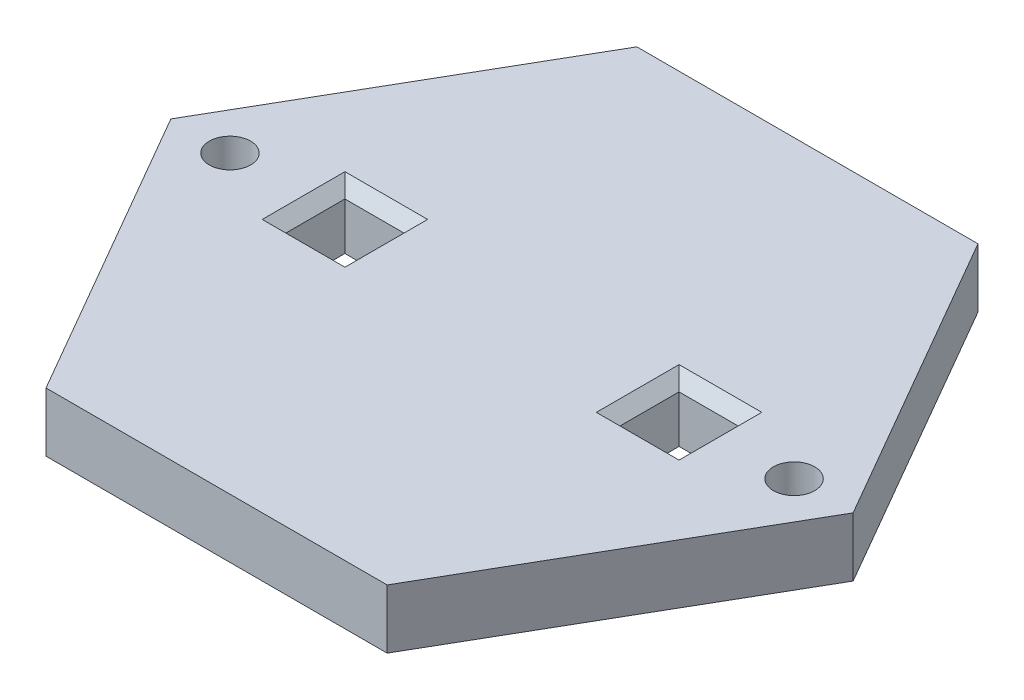
ISO-10303-21;
HEADER;
FILE_DESCRIPTION(('STEP AP214'),'2;1');
FILE_NAME('part.step','',(''),(''),'','','');
FILE_SCHEMA(('AUTOMOTIVE_DESIGN { 1 0 10303 214 1 1 1 1 }'));
ENDSEC;
DATA;
#1=APPLICATION_CONTEXT('core data for automotive mechanical design processes');
#2=APPLICATION_PROTOCOL_DEFINITION('international standard','automotive_design',2000,#1);
#3=PRODUCT_CONTEXT('',#1,'mechanical');
#4=PRODUCT('Part','Part','',(#3));
#5=PRODUCT_RELATED_PRODUCT_CATEGORY('part','',(#4));
#6=PRODUCT_DEFINITION_FORMATION('','',#4);
#7=PRODUCT_DEFINITION_CONTEXT('part definition',#1,'design');
#8=PRODUCT_DEFINITION('design','',#6,#7);
#9=PRODUCT_DEFINITION_SHAPE('','',#8);
#10=(LENGTH_UNIT() NAMED_UNIT(*) SI_UNIT(.MILLI.,.METRE.));
#11=(NAMED_UNIT(*) PLANE_ANGLE_UNIT() SI_UNIT($,.RADIAN.));
#12=(NAMED_UNIT(*) SI_UNIT($,.STERADIAN.) SOLID_ANGLE_UNIT());
#13=UNCERTAINTY_MEASURE_WITH_UNIT(LENGTH_MEASURE(1.E-05),#10,'distance_accuracy_value','');
#14=(GEOMETRIC_REPRESENTATION_CONTEXT(3) GLOBAL_UNCERTAINTY_ASSIGNED_CONTEXT((#13)) GLOBAL_UNIT_ASSIGNED_CONTEXT((#10,
#11,#12)) REPRESENTATION_CONTEXT('',''));
#15=CARTESIAN_POINT('',(0.,0.,0.));
#16=DIRECTION('',(0.,0.,1.));
#17=DIRECTION('',(1.,0.,0.));
#18=AXIS2_PLACEMENT_3D('',#15,#16,#17);
#19=CARTESIAN_POINT('',(-14.4337567297409,5.,-24.9999999999998));
#20=DIRECTION('',(0.866025403784442,0.,0.499999999999995));
#21=DIRECTION('',(0.499999999999995,0.,-0.866025403784442));
#22=AXIS2_PLACEMENT_3D('',#19,#20,#21);
#23=PLANE('',#22);
#24=DIRECTION('',(-0.499999999999995,0.,0.866025403784441));
#25=VECTOR('',#24,1.);
#26=CARTESIAN_POINT('',(-14.4337567297409,0.,-24.9999999999998));
#27=LINE('',#26,#25);
#28=CARTESIAN_POINT('',(-14.4337567297409,0.,-24.9999999999998));
#29=VERTEX_POINT('',#28);
#30=CARTESIAN_POINT('',(-28.8675134594813,0.,0.));
#31=VERTEX_POINT('',#30);
#32=EDGE_CURVE('E231',#29,#31,#27,.T.);
#33=ORIENTED_EDGE('',*,*,#32,.T.);
#34=DIRECTION('',(0.,-1.,0.));
#35=VECTOR('',#34,1.);
#36=CARTESIAN_POINT('',(-28.8675134594813,5.,0.));
#37=LINE('',#36,#35);
#38=CARTESIAN_POINT('',(-28.8675134594813,5.,0.));
#39=VERTEX_POINT('',#38);
#40=EDGE_CURVE('E274',#39,#31,#37,.T.);
#41=ORIENTED_EDGE('',*,*,#40,.F.);
#42=DIRECTION('',(-0.499999999999995,0.,0.866025403784441));
#43=VECTOR('',#42,1.);
#44=CARTESIAN_POINT('',(-14.4337567297409,5.,-24.9999999999998));
#45=LINE('',#44,#43);
#46=CARTESIAN_POINT('',(-14.4337567297409,5.,-24.9999999999998));
#47=VERTEX_POINT('',#46);
#48=EDGE_CURVE('E234',#47,#39,#45,.T.);
#49=ORIENTED_EDGE('',*,*,#48,.F.);
#50=DIRECTION('',(0.,-1.,0.));
#51=VECTOR('',#50,1.);
#52=CARTESIAN_POINT('',(-14.4337567297409,5.,-24.9999999999998));
#53=LINE('',#52,#51);
#54=EDGE_CURVE('E248',#47,#29,#53,.T.);
#55=ORIENTED_EDGE('',*,*,#54,.T.);
#56=EDGE_LOOP('',(#33,#41,#49,#55));
#57=FACE_BOUND('',#56,.T.);
#58=ADVANCED_FACE('F33',(#57),#23,.F.);
#59=CARTESIAN_POINT('',(-28.8675134594813,5.,0.));
#60=DIRECTION('',(0.866025403784438,0.,-0.500000000000001));
#61=DIRECTION('',(-0.500000000000001,0.,-0.866025403784438));
#62=AXIS2_PLACEMENT_3D('',#59,#60,#61);
#63=PLANE('',#62);
#64=DIRECTION('',(0.500000000000001,0.,0.866025403784438));
#65=VECTOR('',#64,1.);
#66=CARTESIAN_POINT('',(-28.8675134594813,0.,0.));
#67=LINE('',#66,#65);
#68=CARTESIAN_POINT('',(-14.4337567297406,0.,25.));
#69=VERTEX_POINT('',#68);
#70=EDGE_CURVE('E251',#31,#69,#67,.T.);
#71=ORIENTED_EDGE('',*,*,#70,.T.);
#72=DIRECTION('',(0.,-1.,0.));
#73=VECTOR('',#72,1.);
#74=CARTESIAN_POINT('',(-14.4337567297406,5.,25.));
#75=LINE('',#74,#73);
#76=CARTESIAN_POINT('',(-14.4337567297406,5.,25.));
#77=VERTEX_POINT('',#76);
#78=EDGE_CURVE('E271',#77,#69,#75,.T.);
#79=ORIENTED_EDGE('',*,*,#78,.F.);
#80=DIRECTION('',(0.500000000000001,0.,0.866025403784438));
#81=VECTOR('',#80,1.);
#82=CARTESIAN_POINT('',(-28.8675134594813,5.,0.));
#83=LINE('',#82,#81);
#84=EDGE_CURVE('E237',#39,#77,#83,.T.);
#85=ORIENTED_EDGE('',*,*,#84,.F.);
#86=ORIENTED_EDGE('',*,*,#40,.T.);
#87=EDGE_LOOP('',(#71,#79,#85,#86));
#88=FACE_BOUND('',#87,.T.);
#89=ADVANCED_FACE('F361',(#88),#63,.F.);
#90=CARTESIAN_POINT('',(-14.4337567297406,5.,25.));
#91=DIRECTION('',(0.,0.,-1.));
#92=DIRECTION('',(-1.,0.,0.));
#93=AXIS2_PLACEMENT_3D('',#90,#91,#92);
#94=PLANE('',#93);
#95=DIRECTION('',(1.,0.,0.));
#96=VECTOR('',#95,1.);
#97=CARTESIAN_POINT('',(-14.4337567297406,0.,25.));
#98=LINE('',#97,#96);
#99=CARTESIAN_POINT('',(14.4337567297408,0.,24.9999999999999));
#100=VERTEX_POINT('',#99);
#101=EDGE_CURVE('E253',#69,#100,#98,.T.);
#102=ORIENTED_EDGE('',*,*,#101,.T.);
#103=DIRECTION('',(0.,-1.,0.));
#104=VECTOR('',#103,1.);
#105=CARTESIAN_POINT('',(14.4337567297408,5.,24.9999999999999));
#106=LINE('',#105,#104);
#107=CARTESIAN_POINT('',(14.4337567297408,5.,24.9999999999999));
#108=VERTEX_POINT('',#107);
#109=EDGE_CURVE('E268',#108,#100,#106,.T.);
#110=ORIENTED_EDGE('',*,*,#109,.F.);
#111=DIRECTION('',(1.,0.,0.));
#112=VECTOR('',#111,1.);
#113=CARTESIAN_POINT('',(-14.4337567297406,5.,25.));
#114=LINE('',#113,#112);
#115=EDGE_CURVE('E240',#77,#108,#114,.T.);
#116=ORIENTED_EDGE('',*,*,#115,.F.);
#117=ORIENTED_EDGE('',*,*,#78,.T.);
#118=EDGE_LOOP('',(#102,#110,#116,#117));
#119=FACE_BOUND('',#118,.T.);
#120=ADVANCED_FACE('F367',(#119),#94,.F.);
#121=CARTESIAN_POINT('',(14.4337567297408,5.,24.9999999999999));
#122=DIRECTION('',(-0.866025403784442,0.,-0.499999999999995));
#123=DIRECTION('',(-0.499999999999995,0.,0.866025403784442));
#124=AXIS2_PLACEMENT_3D('',#121,#122,#123);
#125=PLANE('',#124);
#126=DIRECTION('',(0.499999999999995,0.,-0.866025403784441));
#127=VECTOR('',#126,1.);
#128=CARTESIAN_POINT('',(14.4337567297408,0.,24.9999999999999));
#129=LINE('',#128,#127);
#130=CARTESIAN_POINT('',(28.8675134594813,0.,-2.01580769085164E-13));
#131=VERTEX_POINT('',#130);
#132=EDGE_CURVE('E255',#100,#131,#129,.T.);
#133=ORIENTED_EDGE('',*,*,#132,.T.);
#134=DIRECTION('',(0.,-1.,0.));
#135=VECTOR('',#134,1.);
#136=CARTESIAN_POINT('',(28.8675134594813,5.,-2.01580769085164E-13));
#137=LINE('',#136,#135);
#138=CARTESIAN_POINT('',(28.8675134594813,5.,-2.01580769085164E-13));
#139=VERTEX_POINT('',#138);
#140=EDGE_CURVE('E265',#139,#131,#137,.T.);
#141=ORIENTED_EDGE('',*,*,#140,.F.);
#142=DIRECTION('',(0.499999999999995,0.,-0.866025403784441));
#143=VECTOR('',#142,1.);
#144=CARTESIAN_POINT('',(14.4337567297408,5.,24.9999999999999));
#145=LINE('',#144,#143);
#146=EDGE_CURVE('E242',#108,#139,#145,.T.);
#147=ORIENTED_EDGE('',*,*,#146,.F.);
#148=ORIENTED_EDGE('',*,*,#109,.T.);
#149=EDGE_LOOP('',(#133,#141,#147,#148));
#150=FACE_BOUND('',#149,.T.);
#151=ADVANCED_FACE('F520',(#150),#125,.F.);
#152=CARTESIAN_POINT('',(28.8675134594813,5.,-2.01580769085164E-13));
#153=DIRECTION('',(-0.866025403784434,0.,0.500000000000007));
#154=DIRECTION('',(0.500000000000007,0.,0.866025403784435));
#155=AXIS2_PLACEMENT_3D('',#152,#153,#154);
#156=PLANE('',#155);
#157=DIRECTION('',(-0.500000000000007,0.,-0.866025403784434));
#158=VECTOR('',#157,1.);
#159=CARTESIAN_POINT('',(28.8675134594813,0.,-2.01580769085164E-13));
#160=LINE('',#159,#158);
#161=CARTESIAN_POINT('',(14.4337567297404,0.,-25.0000000000001));
#162=VERTEX_POINT('',#161);
#163=EDGE_CURVE('E257',#131,#162,#160,.T.);
#164=ORIENTED_EDGE('',*,*,#163,.T.);
#165=DIRECTION('',(0.,-1.,0.));
#166=VECTOR('',#165,1.);
#167=CARTESIAN_POINT('',(14.4337567297404,5.,-25.0000000000001));
#168=LINE('',#167,#166);
#169=CARTESIAN_POINT('',(14.4337567297404,5.,-25.0000000000001));
#170=VERTEX_POINT('',#169);
#171=EDGE_CURVE('E262',#170,#162,#168,.T.);
#172=ORIENTED_EDGE('',*,*,#171,.F.);
#173=DIRECTION('',(-0.500000000000007,0.,-0.866025403784434));
#174=VECTOR('',#173,1.);
#175=CARTESIAN_POINT('',(28.8675134594813,5.,-2.01580769085164E-13));
#176=LINE('',#175,#174);
#177=EDGE_CURVE('E244',#139,#170,#176,.T.);
#178=ORIENTED_EDGE('',*,*,#177,.F.);
#179=ORIENTED_EDGE('',*,*,#140,.T.);
#180=EDGE_LOOP('',(#164,#172,#178,#179));
#181=FACE_BOUND('',#180,.T.);
#182=ADVANCED_FACE('F510',(#181),#156,.F.);
#183=CARTESIAN_POINT('',(14.4337567297404,5.,-25.0000000000001));
#184=DIRECTION('',(0.,0.,1.));
#185=DIRECTION('',(1.,0.,0.));
#186=AXIS2_PLACEMENT_3D('',#183,#184,#185);
#187=PLANE('',#186);
#188=DIRECTION('',(-1.,0.,0.));
#189=VECTOR('',#188,1.);
#190=CARTESIAN_POINT('',(14.4337567297404,0.,-25.0000000000001));
#191=LINE('',#190,#189);
#192=EDGE_CURVE('E238',#162,#29,#191,.T.);
#193=ORIENTED_EDGE('',*,*,#192,.T.);
#194=ORIENTED_EDGE('',*,*,#54,.F.);
#195=DIRECTION('',(-1.,0.,0.));
#196=VECTOR('',#195,1.);
#197=CARTESIAN_POINT('',(14.4337567297404,5.,-25.0000000000001));
#198=LINE('',#197,#196);
#199=EDGE_CURVE('E246',#170,#47,#198,.T.);
#200=ORIENTED_EDGE('',*,*,#199,.F.);
#201=ORIENTED_EDGE('',*,*,#171,.T.);
#202=EDGE_LOOP('',(#193,#194,#200,#201));
#203=FACE_BOUND('',#202,.T.);
#204=ADVANCED_FACE('F475',(#203),#187,.F.);
#205=CARTESIAN_POINT('',(0.,5.,0.));
#206=DIRECTION('',(0.,1.,0.));
#207=DIRECTION('',(0.,0.,1.));
#208=AXIS2_PLACEMENT_3D('',#205,#206,#207);
#209=PLANE('',#208);
#210=DIRECTION('',(0.,0.,1.));
#211=VECTOR('',#210,1.);
#212=CARTESIAN_POINT('',(17.6375134594813,5.,2.5));
#213=LINE('',#212,#211);
#214=CARTESIAN_POINT('',(17.6375134594813,5.,-3.50000000000001));
#215=VERTEX_POINT('',#214);
#216=CARTESIAN_POINT('',(17.6375134594813,5.,3.50000000000001));
#217=VERTEX_POINT('',#216);
#218=EDGE_CURVE('E293',#215,#217,#213,.T.);
#219=ORIENTED_EDGE('',*,*,#218,.T.);
#220=DIRECTION('',(-1.,0.,0.));
#221=VECTOR('',#220,1.);
#222=CARTESIAN_POINT('',(11.6375134594813,5.,3.50000000000001));
#223=LINE('',#222,#221);
#224=CARTESIAN_POINT('',(10.6375134594813,5.,3.50000000000001));
#225=VERTEX_POINT('',#224);
#226=EDGE_CURVE('E295',#217,#225,#223,.T.);
#227=ORIENTED_EDGE('',*,*,#226,.T.);
#228=DIRECTION('',(0.,0.,-1.));
#229=VECTOR('',#228,1.);
#230=CARTESIAN_POINT('',(10.6375134594813,5.,-2.5));
#231=LINE('',#230,#229);
#232=CARTESIAN_POINT('',(10.6375134594813,5.,-3.50000000000001));
#233=VERTEX_POINT('',#232);
#234=EDGE_CURVE('E291',#225,#233,#231,.T.);
#235=ORIENTED_EDGE('',*,*,#234,.T.);
#236=DIRECTION('',(1.,0.,0.));
#237=VECTOR('',#236,1.);
#238=CARTESIAN_POINT('',(16.6375134594813,5.,-3.50000000000001));
#239=LINE('',#238,#237);
#240=EDGE_CURVE('E289',#233,#215,#239,.T.);
#241=ORIENTED_EDGE('',*,*,#240,.T.);
#242=EDGE_LOOP('',(#219,#227,#235,#241));
#243=FACE_BOUND('',#242,.T.);
#244=DIRECTION('',(0.,0.,1.));
#245=VECTOR('',#244,1.);
#246=CARTESIAN_POINT('',(-10.6375134594813,5.,2.5));
#247=LINE('',#246,#245);
#248=CARTESIAN_POINT('',(-10.6375134594813,5.,-3.50000000000001));
#249=VERTEX_POINT('',#248);
#250=CARTESIAN_POINT('',(-10.6375134594813,5.,3.50000000000001));
#251=VERTEX_POINT('',#250);
#252=EDGE_CURVE('E284',#249,#251,#247,.T.);
#253=ORIENTED_EDGE('',*,*,#252,.T.);
#254=DIRECTION('',(-1.,0.,0.));
#255=VECTOR('',#254,1.);
#256=CARTESIAN_POINT('',(-16.6375134594813,5.,3.50000000000001));
#257=LINE('',#256,#255);
#258=CARTESIAN_POINT('',(-17.6375134594813,5.,3.50000000000001));
#259=VERTEX_POINT('',#258);
#260=EDGE_CURVE('E286',#251,#259,#257,.T.);
#261=ORIENTED_EDGE('',*,*,#260,.T.);
#262=DIRECTION('',(0.,0.,-1.));
#263=VECTOR('',#262,1.);
#264=CARTESIAN_POINT('',(-17.6375134594813,5.,-2.5));
#265=LINE('',#264,#263);
#266=CARTESIAN_POINT('',(-17.6375134594813,5.,-3.50000000000001));
#267=VERTEX_POINT('',#266);
#268=EDGE_CURVE('E282',#259,#267,#265,.T.);
#269=ORIENTED_EDGE('',*,*,#268,.T.);
#270=DIRECTION('',(1.,0.,0.));
#271=VECTOR('',#270,1.);
#272=CARTESIAN_POINT('',(-11.6375134594813,5.,-3.50000000000001));
#273=LINE('',#272,#271);
#274=EDGE_CURVE('E280',#267,#249,#273,.T.);
#275=ORIENTED_EDGE('',*,*,#274,.T.);
#276=EDGE_LOOP('',(#253,#261,#269,#275));
#277=FACE_BOUND('',#276,.T.);
#278=CARTESIAN_POINT('',(23.8675134594813,5.,-1.02094204959178E-13));
#279=DIRECTION('',(0.,1.,0.));
#280=DIRECTION('',(0.,0.,1.));
#281=AXIS2_PLACEMENT_3D('',#278,#279,#280);
#282=CIRCLE('',#281,1.75);
#283=CARTESIAN_POINT('',(23.8675134594813,5.,1.7499999999999));
#284=VERTEX_POINT('',#283);
#285=EDGE_CURVE('E215',#284,#284,#282,.T.);
#286=ORIENTED_EDGE('',*,*,#285,.F.);
#287=EDGE_LOOP('',(#286));
#288=FACE_BOUND('',#287,.T.);
#289=CARTESIAN_POINT('',(-23.8675134594813,5.,0.));
#290=DIRECTION('',(0.,1.,0.));
#291=DIRECTION('',(0.,0.,1.));
#292=AXIS2_PLACEMENT_3D('',#289,#290,#291);
#293=CIRCLE('',#292,1.75);
#294=CARTESIAN_POINT('',(-23.8675134594813,5.,1.75));
#295=VERTEX_POINT('',#294);
#296=EDGE_CURVE('E225',#295,#295,#293,.T.);
#297=ORIENTED_EDGE('',*,*,#296,.F.);
#298=EDGE_LOOP('',(#297));
#299=FACE_BOUND('',#298,.T.);
#300=ORIENTED_EDGE('',*,*,#48,.T.);
#301=ORIENTED_EDGE('',*,*,#84,.T.);
#302=ORIENTED_EDGE('',*,*,#115,.T.);
#303=ORIENTED_EDGE('',*,*,#146,.T.);
#304=ORIENTED_EDGE('',*,*,#177,.T.);
#305=ORIENTED_EDGE('',*,*,#199,.T.);
#306=EDGE_LOOP('',(#300,#301,#302,#303,#304,#305));
#307=FACE_BOUND('',#306,.T.);
#308=ADVANCED_FACE('F332',(#243,#277,#288,#299,#307),#209,.T.);
#309=CARTESIAN_POINT('',(0.,0.,0.));
#310=DIRECTION('',(0.,1.,0.));
#311=DIRECTION('',(0.,0.,1.));
#312=AXIS2_PLACEMENT_3D('',#309,#310,#311);
#313=PLANE('',#312);
#314=DIRECTION('',(1.,0.,0.));
#315=VECTOR('',#314,1.);
#316=CARTESIAN_POINT('',(11.6375134594813,0.,2.5));
#317=LINE('',#316,#315);
#318=CARTESIAN_POINT('',(11.6375134594813,0.,2.5));
#319=VERTEX_POINT('',#318);
#320=CARTESIAN_POINT('',(16.6375134594813,0.,2.5));
#321=VERTEX_POINT('',#320);
#322=EDGE_CURVE('E172',#319,#321,#317,.T.);
#323=ORIENTED_EDGE('',*,*,#322,.T.);
#324=DIRECTION('',(0.,0.,-1.));
#325=VECTOR('',#324,1.);
#326=CARTESIAN_POINT('',(16.6375134594813,0.,-2.5));
#327=LINE('',#326,#325);
#328=CARTESIAN_POINT('',(16.6375134594813,0.,-2.5));
#329=VERTEX_POINT('',#328);
#330=EDGE_CURVE('E165',#321,#329,#327,.T.);
#331=ORIENTED_EDGE('',*,*,#330,.T.);
#332=DIRECTION('',(-1.,0.,0.));
#333=VECTOR('',#332,1.);
#334=CARTESIAN_POINT('',(11.6375134594813,0.,-2.5));
#335=LINE('',#334,#333);
#336=CARTESIAN_POINT('',(11.6375134594813,0.,-2.5));
#337=VERTEX_POINT('',#336);
#338=EDGE_CURVE('E176',#329,#337,#335,.T.);
#339=ORIENTED_EDGE('',*,*,#338,.T.);
#340=DIRECTION('',(0.,0.,1.));
#341=VECTOR('',#340,1.);
#342=CARTESIAN_POINT('',(11.6375134594813,0.,-2.5));
#343=LINE('',#342,#341);
#344=EDGE_CURVE('E181',#337,#319,#343,.T.);
#345=ORIENTED_EDGE('',*,*,#344,.T.);
#346=EDGE_LOOP('',(#323,#331,#339,#345));
#347=FACE_BOUND('',#346,.T.);
#348=DIRECTION('',(1.,0.,0.));
#349=VECTOR('',#348,1.);
#350=CARTESIAN_POINT('',(-16.6375134594813,0.,2.5));
#351=LINE('',#350,#349);
#352=CARTESIAN_POINT('',(-16.6375134594813,0.,2.5));
#353=VERTEX_POINT('',#352);
#354=CARTESIAN_POINT('',(-11.6375134594813,0.,2.5));
#355=VERTEX_POINT('',#354);
#356=EDGE_CURVE('E209',#353,#355,#351,.T.);
#357=ORIENTED_EDGE('',*,*,#356,.T.);
#358=DIRECTION('',(0.,0.,-1.));
#359=VECTOR('',#358,1.);
#360=CARTESIAN_POINT('',(-11.6375134594813,0.,-2.5));
#361=LINE('',#360,#359);
#362=CARTESIAN_POINT('',(-11.6375134594813,0.,-2.5));
#363=VERTEX_POINT('',#362);
#364=EDGE_CURVE('E196',#355,#363,#361,.T.);
#365=ORIENTED_EDGE('',*,*,#364,.T.);
#366=DIRECTION('',(-1.,0.,0.));
#367=VECTOR('',#366,1.);
#368=CARTESIAN_POINT('',(-16.6375134594813,0.,-2.5));
#369=LINE('',#368,#367);
#370=CARTESIAN_POINT('',(-16.6375134594813,0.,-2.5));
#371=VERTEX_POINT('',#370);
#372=EDGE_CURVE('E203',#363,#371,#369,.T.);
#373=ORIENTED_EDGE('',*,*,#372,.T.);
#374=DIRECTION('',(0.,0.,1.));
#375=VECTOR('',#374,1.);
#376=CARTESIAN_POINT('',(-16.6375134594813,0.,-2.5));
#377=LINE('',#376,#375);
#378=EDGE_CURVE('E206',#371,#353,#377,.T.);
#379=ORIENTED_EDGE('',*,*,#378,.T.);
#380=EDGE_LOOP('',(#357,#365,#373,#379));
#381=FACE_BOUND('',#380,.T.);
#382=CARTESIAN_POINT('',(23.8675134594813,0.,-1.02094204959178E-13));
#383=DIRECTION('',(0.,1.,0.));
#384=DIRECTION('',(0.,0.,1.));
#385=AXIS2_PLACEMENT_3D('',#382,#383,#384);
#386=CIRCLE('',#385,1.75);
#387=CARTESIAN_POINT('',(23.8675134594813,0.,1.7499999999999));
#388=VERTEX_POINT('',#387);
#389=EDGE_CURVE('E222',#388,#388,#386,.T.);
#390=ORIENTED_EDGE('',*,*,#389,.T.);
#391=EDGE_LOOP('',(#390));
#392=FACE_BOUND('',#391,.T.);
#393=CARTESIAN_POINT('',(-23.8675134594813,0.,0.));
#394=DIRECTION('',(0.,1.,0.));
#395=DIRECTION('',(0.,0.,1.));
#396=AXIS2_PLACEMENT_3D('',#393,#394,#395);
#397=CIRCLE('',#396,1.75);
#398=CARTESIAN_POINT('',(-23.8675134594813,0.,1.75));
#399=VERTEX_POINT('',#398);
#400=EDGE_CURVE('E228',#399,#399,#397,.T.);
#401=ORIENTED_EDGE('',*,*,#400,.T.);
#402=EDGE_LOOP('',(#401));
#403=FACE_BOUND('',#402,.T.);
#404=ORIENTED_EDGE('',*,*,#32,.F.);
#405=ORIENTED_EDGE('',*,*,#192,.F.);
#406=ORIENTED_EDGE('',*,*,#163,.F.);
#407=ORIENTED_EDGE('',*,*,#132,.F.);
#408=ORIENTED_EDGE('',*,*,#101,.F.);
#409=ORIENTED_EDGE('',*,*,#70,.F.);
#410=EDGE_LOOP('',(#404,#405,#406,#407,#408,#409));
#411=FACE_BOUND('',#410,.T.);
#412=ADVANCED_FACE('F183',(#347,#381,#392,#403,#411),#313,.F.);
#413=CARTESIAN_POINT('',(-23.8675134594813,0.,0.));
#414=DIRECTION('',(0.,1.,0.));
#415=DIRECTION('',(0.,0.,1.));
#416=AXIS2_PLACEMENT_3D('',#413,#414,#415);
#417=CYLINDRICAL_SURFACE('',#416,1.75);
#418=ORIENTED_EDGE('',*,*,#400,.F.);
#419=EDGE_LOOP('',(#418));
#420=FACE_BOUND('',#419,.T.);
#421=ORIENTED_EDGE('',*,*,#296,.T.);
#422=EDGE_LOOP('',(#421));
#423=FACE_BOUND('',#422,.T.);
#424=ADVANCED_FACE('F487',(#420,#423),#417,.F.);
#425=CARTESIAN_POINT('',(23.8675134594813,0.,-1.02094204959178E-13));
#426=DIRECTION('',(0.,1.,0.));
#427=DIRECTION('',(0.,0.,1.));
#428=AXIS2_PLACEMENT_3D('',#425,#426,#427);
#429=CYLINDRICAL_SURFACE('',#428,1.75);
#430=ORIENTED_EDGE('',*,*,#389,.F.);
#431=EDGE_LOOP('',(#430));
#432=FACE_BOUND('',#431,.T.);
#433=ORIENTED_EDGE('',*,*,#285,.T.);
#434=EDGE_LOOP('',(#433));
#435=FACE_BOUND('',#434,.T.);
#436=ADVANCED_FACE('F465',(#432,#435),#429,.F.);
#437=CARTESIAN_POINT('',(-11.6375134594813,0.,-2.5));
#438=DIRECTION('',(1.,0.,0.));
#439=DIRECTION('',(0.,0.,-1.));
#440=AXIS2_PLACEMENT_3D('',#437,#438,#439);
#441=PLANE('',#440);
#442=DIRECTION('',(0.,1.,0.));
#443=VECTOR('',#442,1.);
#444=CARTESIAN_POINT('',(-11.6375134594813,0.,2.5));
#445=LINE('',#444,#443);
#446=CARTESIAN_POINT('',(-11.6375134594813,4.,2.5));
#447=VERTEX_POINT('',#446);
#448=EDGE_CURVE('E213',#355,#447,#445,.T.);
#449=ORIENTED_EDGE('',*,*,#448,.T.);
#450=DIRECTION('',(0.,0.,-1.));
#451=VECTOR('',#450,1.);
#452=CARTESIAN_POINT('',(-11.6375134594813,4.,-2.5));
#453=LINE('',#452,#451);
#454=CARTESIAN_POINT('',(-11.6375134594813,4.,-2.5));
#455=VERTEX_POINT('',#454);
#456=EDGE_CURVE('E56',#447,#455,#453,.T.);
#457=ORIENTED_EDGE('',*,*,#456,.T.);
#458=DIRECTION('',(0.,1.,0.));
#459=VECTOR('',#458,1.);
#460=CARTESIAN_POINT('',(-11.6375134594813,0.,-2.5));
#461=LINE('',#460,#459);
#462=EDGE_CURVE('E212',#363,#455,#461,.T.);
#463=ORIENTED_EDGE('',*,*,#462,.F.);
#464=ORIENTED_EDGE('',*,*,#364,.F.);
#465=EDGE_LOOP('',(#449,#457,#463,#464));
#466=FACE_BOUND('',#465,.T.);
#467=ADVANCED_FACE('F344',(#466),#441,.F.);
#468=CARTESIAN_POINT('',(-16.6375134594813,0.,2.5));
#469=DIRECTION('',(0.,0.,1.));
#470=DIRECTION('',(1.,0.,0.));
#471=AXIS2_PLACEMENT_3D('',#468,#469,#470);
#472=PLANE('',#471);
#473=DIRECTION('',(0.,1.,0.));
#474=VECTOR('',#473,1.);
#475=CARTESIAN_POINT('',(-16.6375134594813,0.,2.5));
#476=LINE('',#475,#474);
#477=CARTESIAN_POINT('',(-16.6375134594813,4.,2.5));
#478=VERTEX_POINT('',#477);
#479=EDGE_CURVE('E216',#353,#478,#476,.T.);
#480=ORIENTED_EDGE('',*,*,#479,.T.);
#481=DIRECTION('',(1.,0.,0.));
#482=VECTOR('',#481,1.);
#483=CARTESIAN_POINT('',(-11.6375134594813,4.,2.5));
#484=LINE('',#483,#482);
#485=EDGE_CURVE('E303',#478,#447,#484,.T.);
#486=ORIENTED_EDGE('',*,*,#485,.T.);
#487=ORIENTED_EDGE('',*,*,#448,.F.);
#488=ORIENTED_EDGE('',*,*,#356,.F.);
#489=EDGE_LOOP('',(#480,#486,#487,#488));
#490=FACE_BOUND('',#489,.T.);
#491=ADVANCED_FACE('F341',(#490),#472,.F.);
#492=CARTESIAN_POINT('',(-16.6375134594813,0.,-2.5));
#493=DIRECTION('',(-1.,0.,0.));
#494=DIRECTION('',(0.,0.,1.));
#495=AXIS2_PLACEMENT_3D('',#492,#493,#494);
#496=PLANE('',#495);
#497=DIRECTION('',(0.,1.,0.));
#498=VECTOR('',#497,1.);
#499=CARTESIAN_POINT('',(-16.6375134594813,0.,-2.5));
#500=LINE('',#499,#498);
#501=CARTESIAN_POINT('',(-16.6375134594813,4.,-2.5));
#502=VERTEX_POINT('',#501);
#503=EDGE_CURVE('E219',#371,#502,#500,.T.);
#504=ORIENTED_EDGE('',*,*,#503,.T.);
#505=DIRECTION('',(0.,0.,1.));
#506=VECTOR('',#505,1.);
#507=CARTESIAN_POINT('',(-16.6375134594813,4.,2.5));
#508=LINE('',#507,#506);
#509=EDGE_CURVE('E42',#502,#478,#508,.T.);
#510=ORIENTED_EDGE('',*,*,#509,.T.);
#511=ORIENTED_EDGE('',*,*,#479,.F.);
#512=ORIENTED_EDGE('',*,*,#378,.F.);
#513=EDGE_LOOP('',(#504,#510,#511,#512));
#514=FACE_BOUND('',#513,.T.);
#515=ADVANCED_FACE('F348',(#514),#496,.F.);
#516=CARTESIAN_POINT('',(-16.6375134594813,0.,-2.5));
#517=DIRECTION('',(0.,0.,-1.));
#518=DIRECTION('',(-1.,0.,0.));
#519=AXIS2_PLACEMENT_3D('',#516,#517,#518);
#520=PLANE('',#519);
#521=ORIENTED_EDGE('',*,*,#462,.T.);
#522=DIRECTION('',(-1.,0.,0.));
#523=VECTOR('',#522,1.);
#524=CARTESIAN_POINT('',(-16.6375134594813,4.,-2.5));
#525=LINE('',#524,#523);
#526=EDGE_CURVE('E11',#455,#502,#525,.T.);
#527=ORIENTED_EDGE('',*,*,#526,.T.);
#528=ORIENTED_EDGE('',*,*,#503,.F.);
#529=ORIENTED_EDGE('',*,*,#372,.F.);
#530=EDGE_LOOP('',(#521,#527,#528,#529));
#531=FACE_BOUND('',#530,.T.);
#532=ADVANCED_FACE('F349',(#531),#520,.F.);
#533=CARTESIAN_POINT('',(16.6375134594813,0.,-2.5));
#534=DIRECTION('',(1.,0.,0.));
#535=DIRECTION('',(0.,0.,-1.));
#536=AXIS2_PLACEMENT_3D('',#533,#534,#535);
#537=PLANE('',#536);
#538=DIRECTION('',(0.,1.,0.));
#539=VECTOR('',#538,1.);
#540=CARTESIAN_POINT('',(16.6375134594813,0.,2.5));
#541=LINE('',#540,#539);
#542=CARTESIAN_POINT('',(16.6375134594813,4.,2.5));
#543=VERTEX_POINT('',#542);
#544=EDGE_CURVE('E194',#321,#543,#541,.T.);
#545=ORIENTED_EDGE('',*,*,#544,.T.);
#546=DIRECTION('',(0.,0.,-1.));
#547=VECTOR('',#546,1.);
#548=CARTESIAN_POINT('',(16.6375134594813,4.,-2.5));
#549=LINE('',#548,#547);
#550=CARTESIAN_POINT('',(16.6375134594813,4.,-2.5));
#551=VERTEX_POINT('',#550);
#552=EDGE_CURVE('E168',#543,#551,#549,.T.);
#553=ORIENTED_EDGE('',*,*,#552,.T.);
#554=DIRECTION('',(0.,1.,0.));
#555=VECTOR('',#554,1.);
#556=CARTESIAN_POINT('',(16.6375134594813,0.,-2.5));
#557=LINE('',#556,#555);
#558=EDGE_CURVE('E160',#329,#551,#557,.T.);
#559=ORIENTED_EDGE('',*,*,#558,.F.);
#560=ORIENTED_EDGE('',*,*,#330,.F.);
#561=EDGE_LOOP('',(#545,#553,#559,#560));
#562=FACE_BOUND('',#561,.T.);
#563=ADVANCED_FACE('F163',(#562),#537,.F.);
#564=CARTESIAN_POINT('',(11.6375134594813,0.,2.5));
#565=DIRECTION('',(0.,0.,1.));
#566=DIRECTION('',(1.,0.,0.));
#567=AXIS2_PLACEMENT_3D('',#564,#565,#566);
#568=PLANE('',#567);
#569=DIRECTION('',(0.,1.,0.));
#570=VECTOR('',#569,1.);
#571=CARTESIAN_POINT('',(11.6375134594813,0.,2.5));
#572=LINE('',#571,#570);
#573=CARTESIAN_POINT('',(11.6375134594813,4.,2.5));
#574=VERTEX_POINT('',#573);
#575=EDGE_CURVE('E197',#319,#574,#572,.T.);
#576=ORIENTED_EDGE('',*,*,#575,.T.);
#577=DIRECTION('',(1.,0.,0.));
#578=VECTOR('',#577,1.);
#579=CARTESIAN_POINT('',(16.6375134594813,4.,2.5));
#580=LINE('',#579,#578);
#581=EDGE_CURVE('E277',#574,#543,#580,.T.);
#582=ORIENTED_EDGE('',*,*,#581,.T.);
#583=ORIENTED_EDGE('',*,*,#544,.F.);
#584=ORIENTED_EDGE('',*,*,#322,.F.);
#585=EDGE_LOOP('',(#576,#582,#583,#584));
#586=FACE_BOUND('',#585,.T.);
#587=ADVANCED_FACE('F356',(#586),#568,.F.);
#588=CARTESIAN_POINT('',(11.6375134594813,0.,-2.5));
#589=DIRECTION('',(-1.,0.,0.));
#590=DIRECTION('',(0.,0.,1.));
#591=AXIS2_PLACEMENT_3D('',#588,#589,#590);
#592=PLANE('',#591);
#593=DIRECTION('',(0.,1.,0.));
#594=VECTOR('',#593,1.);
#595=CARTESIAN_POINT('',(11.6375134594813,0.,-2.5));
#596=LINE('',#595,#594);
#597=CARTESIAN_POINT('',(11.6375134594813,4.,-2.5));
#598=VERTEX_POINT('',#597);
#599=EDGE_CURVE('E171',#337,#598,#596,.T.);
#600=ORIENTED_EDGE('',*,*,#599,.T.);
#601=DIRECTION('',(0.,0.,1.));
#602=VECTOR('',#601,1.);
#603=CARTESIAN_POINT('',(11.6375134594813,4.,2.5));
#604=LINE('',#603,#602);
#605=EDGE_CURVE('E299',#598,#574,#604,.T.);
#606=ORIENTED_EDGE('',*,*,#605,.T.);
#607=ORIENTED_EDGE('',*,*,#575,.F.);
#608=ORIENTED_EDGE('',*,*,#344,.F.);
#609=EDGE_LOOP('',(#600,#606,#607,#608));
#610=FACE_BOUND('',#609,.T.);
#611=ADVANCED_FACE('F419',(#610),#592,.F.);
#612=CARTESIAN_POINT('',(11.6375134594813,0.,-2.5));
#613=DIRECTION('',(0.,0.,-1.));
#614=DIRECTION('',(-1.,0.,0.));
#615=AXIS2_PLACEMENT_3D('',#612,#613,#614);
#616=PLANE('',#615);
#617=ORIENTED_EDGE('',*,*,#558,.T.);
#618=DIRECTION('',(-1.,0.,0.));
#619=VECTOR('',#618,1.);
#620=CARTESIAN_POINT('',(11.6375134594813,4.,-2.5));
#621=LINE('',#620,#619);
#622=EDGE_CURVE('E301',#551,#598,#621,.T.);
#623=ORIENTED_EDGE('',*,*,#622,.T.);
#624=ORIENTED_EDGE('',*,*,#599,.F.);
#625=ORIENTED_EDGE('',*,*,#338,.F.);
#626=EDGE_LOOP('',(#617,#623,#624,#625));
#627=FACE_BOUND('',#626,.T.);
#628=ADVANCED_FACE('F177',(#627),#616,.F.);
#629=CARTESIAN_POINT('',(11.6375134594813,4.,-2.5));
#630=DIRECTION('',(0.,0.70710678118655,0.707106781186545));
#631=DIRECTION('',(1.,0.,0.));
#632=AXIS2_PLACEMENT_3D('',#629,#630,#631);
#633=PLANE('',#632);
#634=DIRECTION('',(0.577350269189627,0.577350269189623,-0.577350269189627));
#635=VECTOR('',#634,1.);
#636=CARTESIAN_POINT('',(16.6375134594813,4.,-2.5));
#637=LINE('',#636,#635);
#638=EDGE_CURVE('E189',#215,#551,#637,.F.);
#639=ORIENTED_EDGE('',*,*,#638,.F.);
#640=ORIENTED_EDGE('',*,*,#240,.F.);
#641=DIRECTION('',(0.577350269189628,-0.577350269189623,0.577350269189627));
#642=VECTOR('',#641,1.);
#643=CARTESIAN_POINT('',(11.6375134594813,4.,-2.5));
#644=LINE('',#643,#642);
#645=EDGE_CURVE('E186',#598,#233,#644,.F.);
#646=ORIENTED_EDGE('',*,*,#645,.F.);
#647=ORIENTED_EDGE('',*,*,#622,.F.);
#648=EDGE_LOOP('',(#639,#640,#646,#647));
#649=FACE_BOUND('',#648,.T.);
#650=ADVANCED_FACE('F383',(#649),#633,.T.);
#651=CARTESIAN_POINT('',(11.6375134594813,4.,-2.5));
#652=DIRECTION('',(0.707106781186544,0.707106781186551,0.));
#653=DIRECTION('',(0.,0.,-1.));
#654=AXIS2_PLACEMENT_3D('',#651,#652,#653);
#655=PLANE('',#654);
#656=ORIENTED_EDGE('',*,*,#645,.T.);
#657=ORIENTED_EDGE('',*,*,#234,.F.);
#658=DIRECTION('',(0.577350269189628,-0.577350269189623,-0.577350269189627));
#659=VECTOR('',#658,1.);
#660=CARTESIAN_POINT('',(11.6375134594813,4.,2.5));
#661=LINE('',#660,#659);
#662=EDGE_CURVE('E310',#574,#225,#661,.F.);
#663=ORIENTED_EDGE('',*,*,#662,.F.);
#664=ORIENTED_EDGE('',*,*,#605,.F.);
#665=EDGE_LOOP('',(#656,#657,#663,#664));
#666=FACE_BOUND('',#665,.T.);
#667=ADVANCED_FACE('F379',(#666),#655,.T.);
#668=CARTESIAN_POINT('',(16.6375134594813,4.,-2.5));
#669=DIRECTION('',(-0.707106781186545,0.70710678118655,0.));
#670=DIRECTION('',(0.,0.,1.));
#671=AXIS2_PLACEMENT_3D('',#668,#669,#670);
#672=PLANE('',#671);
#673=ORIENTED_EDGE('',*,*,#638,.T.);
#674=ORIENTED_EDGE('',*,*,#552,.F.);
#675=DIRECTION('',(0.577350269189627,0.577350269189623,0.577350269189627));
#676=VECTOR('',#675,1.);
#677=CARTESIAN_POINT('',(14.9708467928146,2.33333333333334,0.833333333333325));
#678=LINE('',#677,#676);
#679=EDGE_CURVE('E308',#217,#543,#678,.F.);
#680=ORIENTED_EDGE('',*,*,#679,.F.);
#681=ORIENTED_EDGE('',*,*,#218,.F.);
#682=EDGE_LOOP('',(#673,#674,#680,#681));
#683=FACE_BOUND('',#682,.T.);
#684=ADVANCED_FACE('F375',(#683),#672,.T.);
#685=CARTESIAN_POINT('',(11.6375134594813,4.,2.5));
#686=DIRECTION('',(0.,0.70710678118655,-0.707106781186545));
#687=DIRECTION('',(-1.,0.,0.));
#688=AXIS2_PLACEMENT_3D('',#685,#686,#687);
#689=PLANE('',#688);
#690=ORIENTED_EDGE('',*,*,#662,.T.);
#691=ORIENTED_EDGE('',*,*,#226,.F.);
#692=ORIENTED_EDGE('',*,*,#679,.T.);
#693=ORIENTED_EDGE('',*,*,#581,.F.);
#694=EDGE_LOOP('',(#690,#691,#692,#693));
#695=FACE_BOUND('',#694,.T.);
#696=ADVANCED_FACE('F372',(#695),#689,.T.);
#697=CARTESIAN_POINT('',(-16.6375134594813,4.,-2.5));
#698=DIRECTION('',(0.,0.70710678118655,0.707106781186545));
#699=DIRECTION('',(1.,0.,0.));
#700=AXIS2_PLACEMENT_3D('',#697,#698,#699);
#701=PLANE('',#700);
#702=DIRECTION('',(0.577350269189627,0.577350269189623,-0.577350269189627));
#703=VECTOR('',#702,1.);
#704=CARTESIAN_POINT('',(-11.6375134594813,4.,-2.5));
#705=LINE('',#704,#703);
#706=EDGE_CURVE('E317',#249,#455,#705,.F.);
#707=ORIENTED_EDGE('',*,*,#706,.F.);
#708=ORIENTED_EDGE('',*,*,#274,.F.);
#709=DIRECTION('',(0.577350269189627,-0.577350269189623,0.577350269189627));
#710=VECTOR('',#709,1.);
#711=CARTESIAN_POINT('',(-16.6375134594813,4.,-2.5));
#712=LINE('',#711,#710);
#713=EDGE_CURVE('E37',#502,#267,#712,.F.);
#714=ORIENTED_EDGE('',*,*,#713,.F.);
#715=ORIENTED_EDGE('',*,*,#526,.F.);
#716=EDGE_LOOP('',(#707,#708,#714,#715));
#717=FACE_BOUND('',#716,.T.);
#718=ADVANCED_FACE('F35',(#717),#701,.T.);
#719=CARTESIAN_POINT('',(-16.6375134594813,4.,-2.5));
#720=DIRECTION('',(0.707106781186545,0.70710678118655,0.));
#721=DIRECTION('',(0.,0.,-1.));
#722=AXIS2_PLACEMENT_3D('',#719,#720,#721);
#723=PLANE('',#722);
#724=ORIENTED_EDGE('',*,*,#713,.T.);
#725=ORIENTED_EDGE('',*,*,#268,.F.);
#726=DIRECTION('',(0.577350269189627,-0.577350269189623,-0.577350269189627));
#727=VECTOR('',#726,1.);
#728=CARTESIAN_POINT('',(-16.6375134594813,4.,2.5));
#729=LINE('',#728,#727);
#730=EDGE_CURVE('E316',#478,#259,#729,.F.);
#731=ORIENTED_EDGE('',*,*,#730,.F.);
#732=ORIENTED_EDGE('',*,*,#509,.F.);
#733=EDGE_LOOP('',(#724,#725,#731,#732));
#734=FACE_BOUND('',#733,.T.);
#735=ADVANCED_FACE('F327',(#734),#723,.T.);
#736=CARTESIAN_POINT('',(-11.6375134594813,4.,-2.5));
#737=DIRECTION('',(-0.707106781186545,0.70710678118655,0.));
#738=DIRECTION('',(0.,0.,1.));
#739=AXIS2_PLACEMENT_3D('',#736,#737,#738);
#740=PLANE('',#739);
#741=ORIENTED_EDGE('',*,*,#706,.T.);
#742=ORIENTED_EDGE('',*,*,#456,.F.);
#743=DIRECTION('',(0.577350269189627,0.577350269189623,0.577350269189627));
#744=VECTOR('',#743,1.);
#745=CARTESIAN_POINT('',(-13.304180126148,2.33333333333334,0.833333333333326));
#746=LINE('',#745,#744);
#747=EDGE_CURVE('E314',#251,#447,#746,.F.);
#748=ORIENTED_EDGE('',*,*,#747,.F.);
#749=ORIENTED_EDGE('',*,*,#252,.F.);
#750=EDGE_LOOP('',(#741,#742,#748,#749));
#751=FACE_BOUND('',#750,.T.);
#752=ADVANCED_FACE('F339',(#751),#740,.T.);
#753=CARTESIAN_POINT('',(-16.6375134594813,4.,2.5));
#754=DIRECTION('',(0.,0.70710678118655,-0.707106781186545));
#755=DIRECTION('',(-1.,0.,0.));
#756=AXIS2_PLACEMENT_3D('',#753,#754,#755);
#757=PLANE('',#756);
#758=ORIENTED_EDGE('',*,*,#730,.T.);
#759=ORIENTED_EDGE('',*,*,#260,.F.);
#760=ORIENTED_EDGE('',*,*,#747,.T.);
#761=ORIENTED_EDGE('',*,*,#485,.F.);
#762=EDGE_LOOP('',(#758,#759,#760,#761));
#763=FACE_BOUND('',#762,.T.);
#764=ADVANCED_FACE('F337',(#763),#757,.T.);
#765=CLOSED_SHELL('',(#58,#89,#120,#151,#182,#204,#308,#412,#424,#436,#467,#491,#515,#532,#563,
#587,#611,#628,#650,#667,#684,#696,#718,#735,#752,#764));
#766=MANIFOLD_SOLID_BREP('B2',#765);
#767=ADVANCED_BREP_SHAPE_REPRESENTATION('',(#18,#766),#14);
#768=SHAPE_DEFINITION_REPRESENTATION(#9,#767);
ENDSEC;
END-ISO-10303-21;
